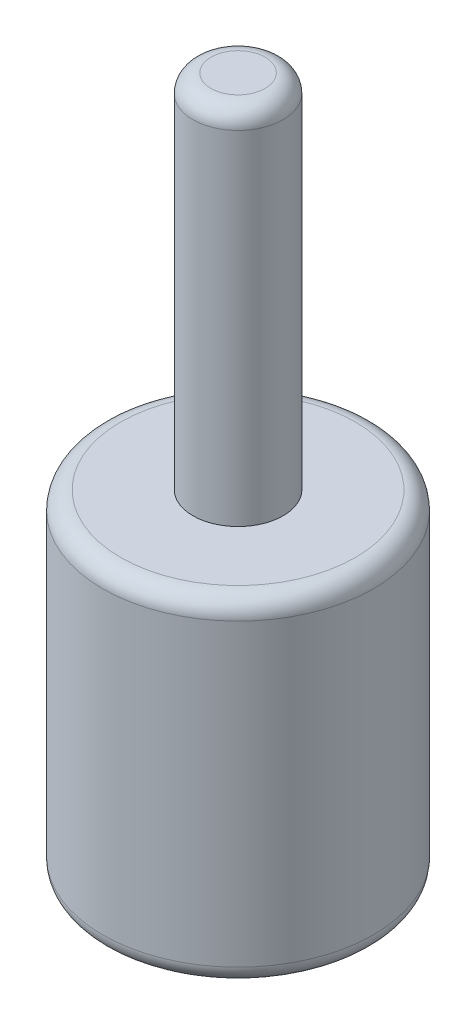
ISO-10303-21;
HEADER;
FILE_DESCRIPTION(('STEP AP214'),'2;1');
FILE_NAME('part.step','',(''),(''),'','','');
FILE_SCHEMA(('AUTOMOTIVE_DESIGN { 1 0 10303 214 1 1 1 1 }'));
ENDSEC;
DATA;
#1=APPLICATION_CONTEXT('core data for automotive mechanical design processes');
#2=APPLICATION_PROTOCOL_DEFINITION('international standard','automotive_design',2000,#1);
#3=PRODUCT_CONTEXT('',#1,'mechanical');
#4=PRODUCT('Part','Part','',(#3));
#5=PRODUCT_RELATED_PRODUCT_CATEGORY('part','',(#4));
#6=PRODUCT_DEFINITION_FORMATION('','',#4);
#7=PRODUCT_DEFINITION_CONTEXT('part definition',#1,'design');
#8=PRODUCT_DEFINITION('design','',#6,#7);
#9=PRODUCT_DEFINITION_SHAPE('','',#8);
#10=(LENGTH_UNIT() NAMED_UNIT(*) SI_UNIT(.MILLI.,.METRE.));
#11=(NAMED_UNIT(*) PLANE_ANGLE_UNIT() SI_UNIT($,.RADIAN.));
#12=(NAMED_UNIT(*) SI_UNIT($,.STERADIAN.) SOLID_ANGLE_UNIT());
#13=UNCERTAINTY_MEASURE_WITH_UNIT(LENGTH_MEASURE(1.E-05),#10,'distance_accuracy_value','');
#14=(GEOMETRIC_REPRESENTATION_CONTEXT(3) GLOBAL_UNCERTAINTY_ASSIGNED_CONTEXT((#13)) GLOBAL_UNIT_ASSIGNED_CONTEXT((#10,
#11,#12)) REPRESENTATION_CONTEXT('',''));
#15=CARTESIAN_POINT('',(0.,0.,0.));
#16=DIRECTION('',(0.,0.,1.));
#17=DIRECTION('',(1.,0.,0.));
#18=AXIS2_PLACEMENT_3D('',#15,#16,#17);
#19=CARTESIAN_POINT('',(-2.13124355915969,18.6,0.));
#20=DIRECTION('',(0.,-1.,0.));
#21=DIRECTION('',(0.,0.,-1.));
#22=AXIS2_PLACEMENT_3D('',#19,#20,#21);
#23=CYLINDRICAL_SURFACE('',#22,7.5);
#24=CARTESIAN_POINT('',(-2.13124355915969,17.6,0.));
#25=DIRECTION('',(0.,1.,0.));
#26=DIRECTION('',(0.,0.,1.));
#27=AXIS2_PLACEMENT_3D('',#24,#25,#26);
#28=CIRCLE('',#27,7.5);
#29=CARTESIAN_POINT('',(-2.13124355915969,17.6,7.5));
#30=VERTEX_POINT('',#29);
#31=EDGE_CURVE('E51',#30,#30,#28,.F.);
#32=ORIENTED_EDGE('',*,*,#31,.T.);
#33=EDGE_LOOP('',(#32));
#34=FACE_BOUND('',#33,.T.);
#35=CARTESIAN_POINT('',(-2.13124355915969,1.,0.));
#36=DIRECTION('',(0.,1.,0.));
#37=DIRECTION('',(0.,0.,1.));
#38=AXIS2_PLACEMENT_3D('',#35,#36,#37);
#39=CIRCLE('',#38,7.5);
#40=CARTESIAN_POINT('',(-2.13124355915969,1.,7.5));
#41=VERTEX_POINT('',#40);
#42=EDGE_CURVE('E56',#41,#41,#39,.T.);
#43=ORIENTED_EDGE('',*,*,#42,.T.);
#44=EDGE_LOOP('',(#43));
#45=FACE_BOUND('',#44,.T.);
#46=ADVANCED_FACE('F43',(#34,#45),#23,.T.);
#47=CARTESIAN_POINT('',(-2.13124355915969,18.6,0.));
#48=DIRECTION('',(0.,1.,0.));
#49=DIRECTION('',(0.,0.,1.));
#50=AXIS2_PLACEMENT_3D('',#47,#48,#49);
#51=PLANE('',#50);
#52=CARTESIAN_POINT('',(-2.13124355915969,18.6,0.));
#53=DIRECTION('',(0.,1.,0.));
#54=DIRECTION('',(0.,0.,1.));
#55=AXIS2_PLACEMENT_3D('',#52,#53,#54);
#56=CIRCLE('',#55,6.5);
#57=CARTESIAN_POINT('',(-2.13124355915969,18.6,6.5));
#58=VERTEX_POINT('',#57);
#59=EDGE_CURVE('E61',#58,#58,#56,.T.);
#60=ORIENTED_EDGE('',*,*,#59,.T.);
#61=EDGE_LOOP('',(#60));
#62=FACE_BOUND('',#61,.T.);
#63=CARTESIAN_POINT('',(-2.13124355915969,18.6,0.));
#64=DIRECTION('',(0.,1.,0.));
#65=DIRECTION('',(0.,0.,1.));
#66=AXIS2_PLACEMENT_3D('',#63,#64,#65);
#67=CIRCLE('',#66,2.5);
#68=CARTESIAN_POINT('',(-2.13124355915969,18.6,2.5));
#69=VERTEX_POINT('',#68);
#70=EDGE_CURVE('E75',#69,#69,#67,.T.);
#71=ORIENTED_EDGE('',*,*,#70,.F.);
#72=EDGE_LOOP('',(#71));
#73=FACE_BOUND('',#72,.T.);
#74=ADVANCED_FACE('F82',(#62,#73),#51,.T.);
#75=CARTESIAN_POINT('',(-2.13124355915969,0.,0.));
#76=DIRECTION('',(0.,1.,0.));
#77=DIRECTION('',(0.,0.,1.));
#78=AXIS2_PLACEMENT_3D('',#75,#76,#77);
#79=PLANE('',#78);
#80=CARTESIAN_POINT('',(-2.13124355915969,0.,0.));
#81=DIRECTION('',(0.,1.,0.));
#82=DIRECTION('',(0.,0.,1.));
#83=AXIS2_PLACEMENT_3D('',#80,#81,#82);
#84=CIRCLE('',#83,6.5);
#85=CARTESIAN_POINT('',(-2.13124355915969,0.,6.5));
#86=VERTEX_POINT('',#85);
#87=EDGE_CURVE('E10',#86,#86,#84,.F.);
#88=ORIENTED_EDGE('',*,*,#87,.T.);
#89=EDGE_LOOP('',(#88));
#90=FACE_BOUND('',#89,.T.);
#91=ADVANCED_FACE('F84',(#90),#79,.F.);
#92=CARTESIAN_POINT('',(-2.13124355915969,38.6,0.));
#93=DIRECTION('',(0.,-1.,0.));
#94=DIRECTION('',(0.,0.,-1.));
#95=AXIS2_PLACEMENT_3D('',#92,#93,#94);
#96=CYLINDRICAL_SURFACE('',#95,2.5);
#97=CARTESIAN_POINT('',(-2.13124355915969,37.6,0.));
#98=DIRECTION('',(0.,1.,0.));
#99=DIRECTION('',(0.,0.,1.));
#100=AXIS2_PLACEMENT_3D('',#97,#98,#99);
#101=CIRCLE('',#100,2.5);
#102=CARTESIAN_POINT('',(-2.13124355915969,37.6,2.5));
#103=VERTEX_POINT('',#102);
#104=EDGE_CURVE('E67',#103,#103,#101,.F.);
#105=ORIENTED_EDGE('',*,*,#104,.T.);
#106=EDGE_LOOP('',(#105));
#107=FACE_BOUND('',#106,.T.);
#108=ORIENTED_EDGE('',*,*,#70,.T.);
#109=EDGE_LOOP('',(#108));
#110=FACE_BOUND('',#109,.T.);
#111=ADVANCED_FACE('F80',(#107,#110),#96,.T.);
#112=CARTESIAN_POINT('',(-2.13124355915969,38.6,0.));
#113=DIRECTION('',(0.,1.,0.));
#114=DIRECTION('',(0.,0.,1.));
#115=AXIS2_PLACEMENT_3D('',#112,#113,#114);
#116=PLANE('',#115);
#117=CARTESIAN_POINT('',(-2.13124355915969,38.6,0.));
#118=DIRECTION('',(0.,1.,0.));
#119=DIRECTION('',(0.,0.,1.));
#120=AXIS2_PLACEMENT_3D('',#117,#118,#119);
#121=CIRCLE('',#120,1.5);
#122=CARTESIAN_POINT('',(-2.13124355915969,38.6,1.5));
#123=VERTEX_POINT('',#122);
#124=EDGE_CURVE('E71',#123,#123,#121,.T.);
#125=ORIENTED_EDGE('',*,*,#124,.T.);
#126=EDGE_LOOP('',(#125));
#127=FACE_BOUND('',#126,.T.);
#128=ADVANCED_FACE('F99',(#127),#116,.T.);
#129=CARTESIAN_POINT('',(-2.13124355915969,37.6,0.));
#130=DIRECTION('',(0.,1.,0.));
#131=DIRECTION('',(0.,0.,1.));
#132=AXIS2_PLACEMENT_3D('',#129,#130,#131);
#133=TOROIDAL_SURFACE('',#132,1.5,1.);
#134=ORIENTED_EDGE('',*,*,#104,.F.);
#135=EDGE_LOOP('',(#134));
#136=FACE_BOUND('',#135,.T.);
#137=ORIENTED_EDGE('',*,*,#124,.F.);
#138=EDGE_LOOP('',(#137));
#139=FACE_BOUND('',#138,.T.);
#140=ADVANCED_FACE('F96',(#136,#139),#133,.T.);
#141=CARTESIAN_POINT('',(-2.13124355915969,17.6,0.));
#142=DIRECTION('',(0.,1.,0.));
#143=DIRECTION('',(0.,0.,1.));
#144=AXIS2_PLACEMENT_3D('',#141,#142,#143);
#145=TOROIDAL_SURFACE('',#144,6.5,1.);
#146=ORIENTED_EDGE('',*,*,#31,.F.);
#147=EDGE_LOOP('',(#146));
#148=FACE_BOUND('',#147,.T.);
#149=ORIENTED_EDGE('',*,*,#59,.F.);
#150=EDGE_LOOP('',(#149));
#151=FACE_BOUND('',#150,.T.);
#152=ADVANCED_FACE('F98',(#148,#151),#145,.T.);
#153=CARTESIAN_POINT('',(-2.13124355915969,1.,0.));
#154=DIRECTION('',(0.,1.,0.));
#155=DIRECTION('',(0.,0.,1.));
#156=AXIS2_PLACEMENT_3D('',#153,#154,#155);
#157=TOROIDAL_SURFACE('',#156,6.5,1.);
#158=ORIENTED_EDGE('',*,*,#87,.F.);
#159=EDGE_LOOP('',(#158));
#160=FACE_BOUND('',#159,.T.);
#161=ORIENTED_EDGE('',*,*,#42,.F.);
#162=EDGE_LOOP('',(#161));
#163=FACE_BOUND('',#162,.T.);
#164=ADVANCED_FACE('F45',(#160,#163),#157,.T.);
#165=CLOSED_SHELL('',(#46,#74,#91,#111,#128,#140,#152,#164));
#166=MANIFOLD_SOLID_BREP('B2',#165);
#167=ADVANCED_BREP_SHAPE_REPRESENTATION('',(#18,#166),#14);
#168=SHAPE_DEFINITION_REPRESENTATION(#9,#167);
ENDSEC;
END-ISO-10303-21;
